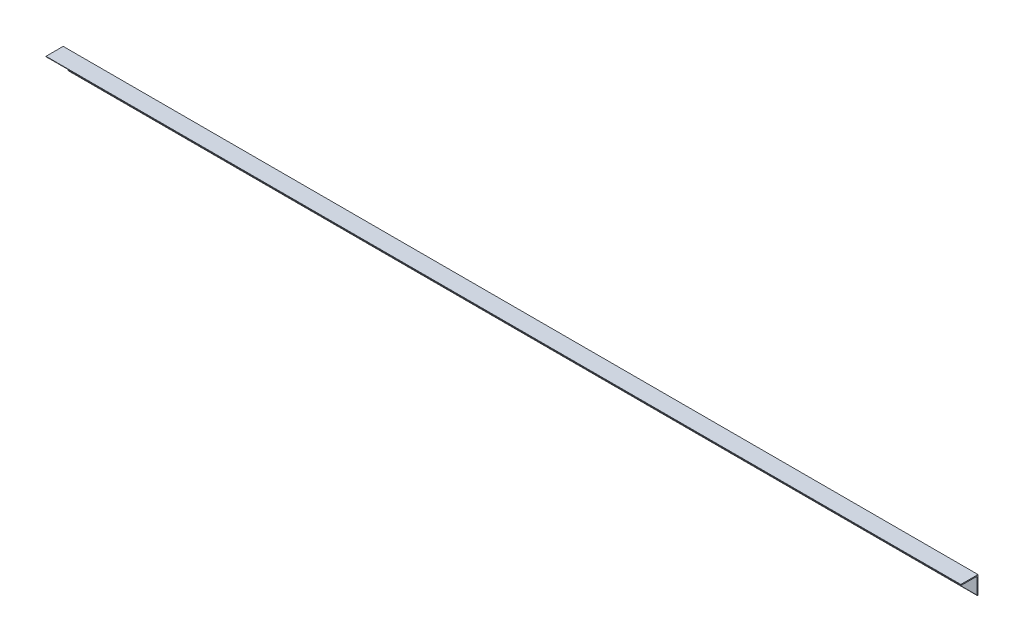
ISO-10303-21;
HEADER;
FILE_DESCRIPTION(('STEP AP214'),'2;1');
FILE_NAME('part.step','',(''),(''),'','','');
FILE_SCHEMA(('AUTOMOTIVE_DESIGN { 1 0 10303 214 1 1 1 1 }'));
ENDSEC;
DATA;
#1=APPLICATION_CONTEXT('core data for automotive mechanical design processes');
#2=APPLICATION_PROTOCOL_DEFINITION('international standard','automotive_design',2000,#1);
#3=PRODUCT_CONTEXT('',#1,'mechanical');
#4=PRODUCT('Part','Part','',(#3));
#5=PRODUCT_RELATED_PRODUCT_CATEGORY('part','',(#4));
#6=PRODUCT_DEFINITION_FORMATION('','',#4);
#7=PRODUCT_DEFINITION_CONTEXT('part definition',#1,'design');
#8=PRODUCT_DEFINITION('design','',#6,#7);
#9=PRODUCT_DEFINITION_SHAPE('','',#8);
#10=(LENGTH_UNIT() NAMED_UNIT(*) SI_UNIT(.MILLI.,.METRE.));
#11=(NAMED_UNIT(*) PLANE_ANGLE_UNIT() SI_UNIT($,.RADIAN.));
#12=(NAMED_UNIT(*) SI_UNIT($,.STERADIAN.) SOLID_ANGLE_UNIT());
#13=UNCERTAINTY_MEASURE_WITH_UNIT(LENGTH_MEASURE(1.E-05),#10,'distance_accuracy_value','');
#14=(GEOMETRIC_REPRESENTATION_CONTEXT(3) GLOBAL_UNCERTAINTY_ASSIGNED_CONTEXT((#13)) GLOBAL_UNIT_ASSIGNED_CONTEXT((#10,
#11,#12)) REPRESENTATION_CONTEXT('',''));
#15=CARTESIAN_POINT('',(0.,0.,0.));
#16=DIRECTION('',(0.,0.,1.));
#17=DIRECTION('',(1.,0.,0.));
#18=AXIS2_PLACEMENT_3D('',#15,#16,#17);
#19=CARTESIAN_POINT('',(-4525.,-90.,0.));
#20=DIRECTION('',(0.,0.,1.));
#21=DIRECTION('',(1.,0.,0.));
#22=AXIS2_PLACEMENT_3D('',#19,#20,#21);
#23=PLANE('',#22);
#24=DIRECTION('',(0.,1.,0.));
#25=VECTOR('',#24,1.);
#26=CARTESIAN_POINT('',(-4495.,-4.99999999999999,0.));
#27=LINE('',#26,#25);
#28=CARTESIAN_POINT('',(-4495.,-90.,0.));
#29=VERTEX_POINT('',#28);
#30=CARTESIAN_POINT('',(-4495.,-4.99999999999999,0.));
#31=VERTEX_POINT('',#30);
#32=EDGE_CURVE('E135',#29,#31,#27,.T.);
#33=ORIENTED_EDGE('',*,*,#32,.T.);
#34=DIRECTION('',(-1.,0.,0.));
#35=VECTOR('',#34,1.);
#36=CARTESIAN_POINT('',(-4525.,-4.99999999999999,0.));
#37=LINE('',#36,#35);
#38=CARTESIAN_POINT('',(-4525.,-4.99999999999999,0.));
#39=VERTEX_POINT('',#38);
#40=EDGE_CURVE('E146',#31,#39,#37,.T.);
#41=ORIENTED_EDGE('',*,*,#40,.T.);
#42=DIRECTION('',(0.,-1.,0.));
#43=VECTOR('',#42,1.);
#44=CARTESIAN_POINT('',(-4525.,-90.,0.));
#45=LINE('',#44,#43);
#46=CARTESIAN_POINT('',(-4525.,0.,0.));
#47=VERTEX_POINT('',#46);
#48=EDGE_CURVE('E178',#47,#39,#45,.T.);
#49=ORIENTED_EDGE('',*,*,#48,.F.);
#50=DIRECTION('',(1.,0.,0.));
#51=VECTOR('',#50,1.);
#52=CARTESIAN_POINT('',(-4525.,0.,0.));
#53=LINE('',#52,#51);
#54=CARTESIAN_POINT('',(0.,0.,0.));
#55=VERTEX_POINT('',#54);
#56=EDGE_CURVE('E159',#47,#55,#53,.T.);
#57=ORIENTED_EDGE('',*,*,#56,.T.);
#58=DIRECTION('',(0.,-1.,0.));
#59=VECTOR('',#58,1.);
#60=CARTESIAN_POINT('',(0.,-90.,0.));
#61=LINE('',#60,#59);
#62=CARTESIAN_POINT('',(0.,-90.,0.));
#63=VERTEX_POINT('',#62);
#64=EDGE_CURVE('E153',#55,#63,#61,.T.);
#65=ORIENTED_EDGE('',*,*,#64,.T.);
#66=DIRECTION('',(1.,0.,0.));
#67=VECTOR('',#66,1.);
#68=CARTESIAN_POINT('',(-4525.,-90.,0.));
#69=LINE('',#68,#67);
#70=EDGE_CURVE('E13',#29,#63,#69,.T.);
#71=ORIENTED_EDGE('',*,*,#70,.F.);
#72=EDGE_LOOP('',(#33,#41,#49,#57,#65,#71));
#73=FACE_BOUND('',#72,.T.);
#74=ADVANCED_FACE('F65',(#73),#23,.F.);
#75=CARTESIAN_POINT('',(-4525.,-85.,0.));
#76=DIRECTION('',(1.,0.,0.));
#77=DIRECTION('',(0.,0.,-1.));
#78=AXIS2_PLACEMENT_3D('',#75,#76,#77);
#79=CYLINDRICAL_SURFACE('',#78,5.);
#80=DIRECTION('',(1.,0.,0.));
#81=VECTOR('',#80,1.);
#82=CARTESIAN_POINT('',(-4525.,-85.,4.99999999999999));
#83=LINE('',#82,#81);
#84=CARTESIAN_POINT('',(-4495.,-85.,4.99999999999999));
#85=VERTEX_POINT('',#84);
#86=CARTESIAN_POINT('',(0.,-85.,4.99999999999999));
#87=VERTEX_POINT('',#86);
#88=EDGE_CURVE('E73',#85,#87,#83,.T.);
#89=ORIENTED_EDGE('',*,*,#88,.F.);
#90=CARTESIAN_POINT('',(-4495.,-85.,0.));
#91=DIRECTION('',(1.,0.,0.));
#92=DIRECTION('',(0.,0.,-1.));
#93=AXIS2_PLACEMENT_3D('',#90,#91,#92);
#94=CIRCLE('',#93,5.);
#95=EDGE_CURVE('E138',#85,#29,#94,.T.);
#96=ORIENTED_EDGE('',*,*,#95,.T.);
#97=ORIENTED_EDGE('',*,*,#70,.T.);
#98=CARTESIAN_POINT('',(0.,-85.,0.));
#99=DIRECTION('',(-1.,0.,0.));
#100=DIRECTION('',(0.,0.,1.));
#101=AXIS2_PLACEMENT_3D('',#98,#99,#100);
#102=CIRCLE('',#101,5.);
#103=EDGE_CURVE('E161',#63,#87,#102,.T.);
#104=ORIENTED_EDGE('',*,*,#103,.T.);
#105=EDGE_LOOP('',(#89,#96,#97,#104));
#106=FACE_BOUND('',#105,.T.);
#107=ADVANCED_FACE('F150',(#106),#79,.T.);
#108=CARTESIAN_POINT('',(-4525.,-10.,5.));
#109=DIRECTION('',(0.,0.,-1.));
#110=DIRECTION('',(0.,1.,0.));
#111=AXIS2_PLACEMENT_3D('',#108,#109,#110);
#112=PLANE('',#111);
#113=DIRECTION('',(1.,0.,0.));
#114=VECTOR('',#113,1.);
#115=CARTESIAN_POINT('',(-4525.,-10.,5.));
#116=LINE('',#115,#114);
#117=CARTESIAN_POINT('',(-4495.,-10.,5.));
#118=VERTEX_POINT('',#117);
#119=CARTESIAN_POINT('',(0.,-10.,5.));
#120=VERTEX_POINT('',#119);
#121=EDGE_CURVE('E186',#118,#120,#116,.T.);
#122=ORIENTED_EDGE('',*,*,#121,.F.);
#123=DIRECTION('',(0.,-1.,0.));
#124=VECTOR('',#123,1.);
#125=CARTESIAN_POINT('',(-4495.,-10.,5.));
#126=LINE('',#125,#124);
#127=EDGE_CURVE('E154',#118,#85,#126,.T.);
#128=ORIENTED_EDGE('',*,*,#127,.T.);
#129=ORIENTED_EDGE('',*,*,#88,.T.);
#130=DIRECTION('',(0.,1.,0.));
#131=VECTOR('',#130,1.);
#132=CARTESIAN_POINT('',(0.,-10.,5.));
#133=LINE('',#132,#131);
#134=EDGE_CURVE('E163',#87,#120,#133,.T.);
#135=ORIENTED_EDGE('',*,*,#134,.T.);
#136=EDGE_LOOP('',(#122,#128,#129,#135));
#137=FACE_BOUND('',#136,.T.);
#138=ADVANCED_FACE('F189',(#137),#112,.F.);
#139=CARTESIAN_POINT('',(-4525.,-10.,10.));
#140=DIRECTION('',(1.,0.,0.));
#141=DIRECTION('',(0.,0.,-1.));
#142=AXIS2_PLACEMENT_3D('',#139,#140,#141);
#143=CYLINDRICAL_SURFACE('',#142,5.);
#144=DIRECTION('',(1.,0.,0.));
#145=VECTOR('',#144,1.);
#146=CARTESIAN_POINT('',(-4525.,-5.,10.));
#147=LINE('',#146,#145);
#148=CARTESIAN_POINT('',(-4495.,-4.99999999999999,9.99999999999999));
#149=VERTEX_POINT('',#148);
#150=CARTESIAN_POINT('',(0.,-5.,10.));
#151=VERTEX_POINT('',#150);
#152=EDGE_CURVE('E184',#149,#151,#147,.T.);
#153=ORIENTED_EDGE('',*,*,#152,.F.);
#154=CARTESIAN_POINT('',(-4495.,-10.,10.));
#155=DIRECTION('',(1.,0.,0.));
#156=DIRECTION('',(0.,0.,-1.));
#157=AXIS2_PLACEMENT_3D('',#154,#155,#156);
#158=CIRCLE('',#157,5.);
#159=EDGE_CURVE('E198',#149,#118,#158,.F.);
#160=ORIENTED_EDGE('',*,*,#159,.T.);
#161=ORIENTED_EDGE('',*,*,#121,.T.);
#162=CARTESIAN_POINT('',(0.,-10.,10.));
#163=DIRECTION('',(1.,0.,0.));
#164=DIRECTION('',(0.,0.,-1.));
#165=AXIS2_PLACEMENT_3D('',#162,#163,#164);
#166=CIRCLE('',#165,5.);
#167=EDGE_CURVE('E170',#120,#151,#166,.T.);
#168=ORIENTED_EDGE('',*,*,#167,.T.);
#169=EDGE_LOOP('',(#153,#160,#161,#168));
#170=FACE_BOUND('',#169,.T.);
#171=ADVANCED_FACE('F196',(#170),#143,.F.);
#172=CARTESIAN_POINT('',(-4525.,-4.99999999999999,80.));
#173=DIRECTION('',(0.,1.,0.));
#174=DIRECTION('',(0.,0.,1.));
#175=AXIS2_PLACEMENT_3D('',#172,#173,#174);
#176=PLANE('',#175);
#177=DIRECTION('',(0.,0.,1.));
#178=VECTOR('',#177,1.);
#179=CARTESIAN_POINT('',(0.,-4.99999999999999,80.));
#180=LINE('',#179,#178);
#181=CARTESIAN_POINT('',(0.,-4.99999999999999,80.));
#182=VERTEX_POINT('',#181);
#183=EDGE_CURVE('E173',#151,#182,#180,.T.);
#184=ORIENTED_EDGE('',*,*,#183,.T.);
#185=DIRECTION('',(1.,0.,0.));
#186=VECTOR('',#185,1.);
#187=CARTESIAN_POINT('',(-4525.,-4.99999999999999,80.));
#188=LINE('',#187,#186);
#189=CARTESIAN_POINT('',(-4525.,-4.99999999999999,80.));
#190=VERTEX_POINT('',#189);
#191=EDGE_CURVE('E182',#190,#182,#188,.T.);
#192=ORIENTED_EDGE('',*,*,#191,.F.);
#193=DIRECTION('',(0.,0.,1.));
#194=VECTOR('',#193,1.);
#195=CARTESIAN_POINT('',(-4525.,-4.99999999999999,80.));
#196=LINE('',#195,#194);
#197=EDGE_CURVE('E115',#39,#190,#196,.T.);
#198=ORIENTED_EDGE('',*,*,#197,.F.);
#199=ORIENTED_EDGE('',*,*,#40,.F.);
#200=DIRECTION('',(0.,0.,1.));
#201=VECTOR('',#200,1.);
#202=CARTESIAN_POINT('',(-4495.,-4.99999999999999,0.));
#203=LINE('',#202,#201);
#204=EDGE_CURVE('E141',#31,#149,#203,.T.);
#205=ORIENTED_EDGE('',*,*,#204,.T.);
#206=ORIENTED_EDGE('',*,*,#152,.T.);
#207=EDGE_LOOP('',(#184,#192,#198,#199,#205,#206));
#208=FACE_BOUND('',#207,.T.);
#209=ADVANCED_FACE('F211',(#208),#176,.F.);
#210=CARTESIAN_POINT('',(-4525.,0.,80.));
#211=DIRECTION('',(1.,0.,0.));
#212=DIRECTION('',(0.,0.,-1.));
#213=AXIS2_PLACEMENT_3D('',#210,#211,#212);
#214=CYLINDRICAL_SURFACE('',#213,5.);
#215=CARTESIAN_POINT('',(0.,0.,80.));
#216=DIRECTION('',(-1.,0.,0.));
#217=DIRECTION('',(0.,0.,-1.));
#218=AXIS2_PLACEMENT_3D('',#215,#216,#217);
#219=CIRCLE('',#218,5.);
#220=CARTESIAN_POINT('',(0.,0.,85.));
#221=VERTEX_POINT('',#220);
#222=EDGE_CURVE('E106',#182,#221,#219,.T.);
#223=ORIENTED_EDGE('',*,*,#222,.T.);
#224=DIRECTION('',(1.,0.,0.));
#225=VECTOR('',#224,1.);
#226=CARTESIAN_POINT('',(-4525.,0.,85.));
#227=LINE('',#226,#225);
#228=CARTESIAN_POINT('',(-4525.,0.,85.));
#229=VERTEX_POINT('',#228);
#230=EDGE_CURVE('E180',#229,#221,#227,.T.);
#231=ORIENTED_EDGE('',*,*,#230,.F.);
#232=CARTESIAN_POINT('',(-4525.,0.,80.));
#233=DIRECTION('',(-1.,0.,0.));
#234=DIRECTION('',(0.,0.,-1.));
#235=AXIS2_PLACEMENT_3D('',#232,#233,#234);
#236=CIRCLE('',#235,5.);
#237=EDGE_CURVE('E205',#190,#229,#236,.T.);
#238=ORIENTED_EDGE('',*,*,#237,.F.);
#239=ORIENTED_EDGE('',*,*,#191,.T.);
#240=EDGE_LOOP('',(#223,#231,#238,#239));
#241=FACE_BOUND('',#240,.T.);
#242=ADVANCED_FACE('F208',(#241),#214,.T.);
#243=CARTESIAN_POINT('',(-4525.,0.,0.));
#244=DIRECTION('',(0.,-1.,0.));
#245=DIRECTION('',(0.,0.,-1.));
#246=AXIS2_PLACEMENT_3D('',#243,#244,#245);
#247=PLANE('',#246);
#248=DIRECTION('',(0.,0.,-1.));
#249=VECTOR('',#248,1.);
#250=CARTESIAN_POINT('',(0.,0.,0.));
#251=LINE('',#250,#249);
#252=EDGE_CURVE('E111',#221,#55,#251,.T.);
#253=ORIENTED_EDGE('',*,*,#252,.T.);
#254=ORIENTED_EDGE('',*,*,#56,.F.);
#255=DIRECTION('',(0.,0.,-1.));
#256=VECTOR('',#255,1.);
#257=CARTESIAN_POINT('',(-4525.,0.,0.));
#258=LINE('',#257,#256);
#259=EDGE_CURVE('E81',#229,#47,#258,.T.);
#260=ORIENTED_EDGE('',*,*,#259,.F.);
#261=ORIENTED_EDGE('',*,*,#230,.T.);
#262=EDGE_LOOP('',(#253,#254,#260,#261));
#263=FACE_BOUND('',#262,.T.);
#264=ADVANCED_FACE('F209',(#263),#247,.F.);
#265=CARTESIAN_POINT('',(-4525.,0.,80.));
#266=DIRECTION('',(1.,0.,0.));
#267=DIRECTION('',(0.,0.,-1.));
#268=AXIS2_PLACEMENT_3D('',#265,#266,#267);
#269=PLANE('',#268);
#270=ORIENTED_EDGE('',*,*,#48,.T.);
#271=ORIENTED_EDGE('',*,*,#197,.T.);
#272=ORIENTED_EDGE('',*,*,#237,.T.);
#273=ORIENTED_EDGE('',*,*,#259,.T.);
#274=EDGE_LOOP('',(#270,#271,#272,#273));
#275=FACE_BOUND('',#274,.T.);
#276=ADVANCED_FACE('F207',(#275),#269,.F.);
#277=CARTESIAN_POINT('',(0.,0.,80.));
#278=DIRECTION('',(1.,0.,0.));
#279=DIRECTION('',(0.,0.,-1.));
#280=AXIS2_PLACEMENT_3D('',#277,#278,#279);
#281=PLANE('',#280);
#282=ORIENTED_EDGE('',*,*,#64,.F.);
#283=ORIENTED_EDGE('',*,*,#252,.F.);
#284=ORIENTED_EDGE('',*,*,#222,.F.);
#285=ORIENTED_EDGE('',*,*,#183,.F.);
#286=ORIENTED_EDGE('',*,*,#167,.F.);
#287=ORIENTED_EDGE('',*,*,#134,.F.);
#288=ORIENTED_EDGE('',*,*,#103,.F.);
#289=EDGE_LOOP('',(#282,#283,#284,#285,#286,#287,#288));
#290=FACE_BOUND('',#289,.T.);
#291=ADVANCED_FACE('F192',(#290),#281,.T.);
#292=CARTESIAN_POINT('',(-4495.,-4.99999999999999,0.));
#293=DIRECTION('',(1.,0.,0.));
#294=DIRECTION('',(0.,0.,-1.));
#295=AXIS2_PLACEMENT_3D('',#292,#293,#294);
#296=PLANE('',#295);
#297=ORIENTED_EDGE('',*,*,#127,.F.);
#298=ORIENTED_EDGE('',*,*,#159,.F.);
#299=ORIENTED_EDGE('',*,*,#204,.F.);
#300=ORIENTED_EDGE('',*,*,#32,.F.);
#301=ORIENTED_EDGE('',*,*,#95,.F.);
#302=EDGE_LOOP('',(#297,#298,#299,#300,#301));
#303=FACE_BOUND('',#302,.T.);
#304=ADVANCED_FACE('F137',(#303),#296,.F.);
#305=CLOSED_SHELL('',(#74,#107,#138,#171,#209,#242,#264,#276,#291,#304));
#306=MANIFOLD_SOLID_BREP('B2',#305);
#307=ADVANCED_BREP_SHAPE_REPRESENTATION('',(#18,#306),#14);
#308=SHAPE_DEFINITION_REPRESENTATION(#9,#307);
ENDSEC;
END-ISO-10303-21;
